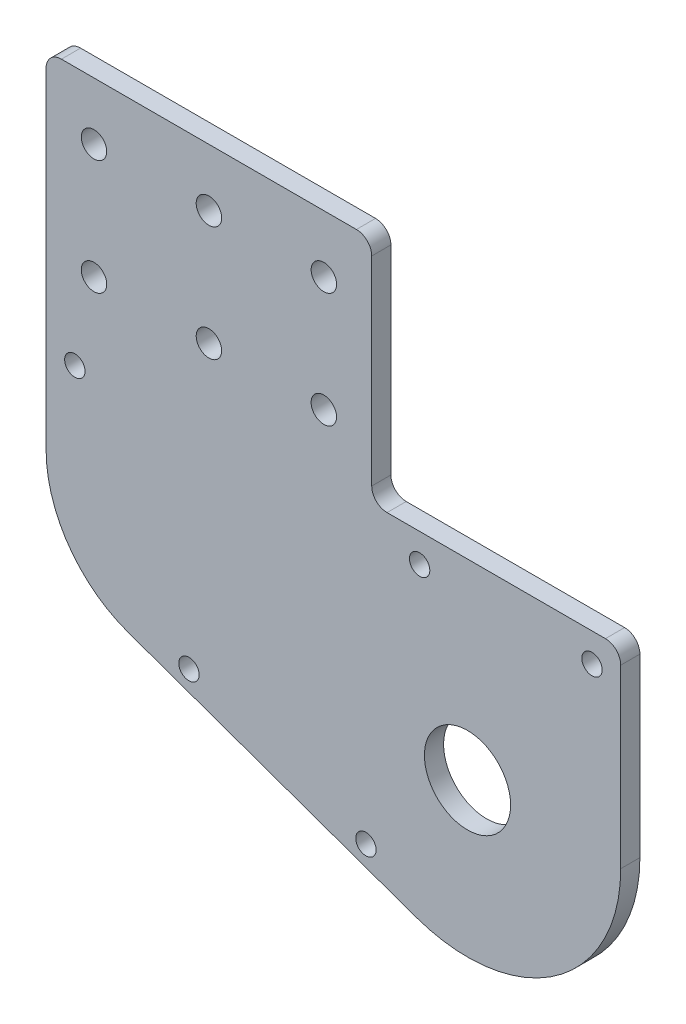
ISO-10303-21;
HEADER;
FILE_DESCRIPTION(('STEP AP214'),'2;1');
FILE_NAME('part.step','',(''),(''),'','','');
FILE_SCHEMA(('AUTOMOTIVE_DESIGN { 1 0 10303 214 1 1 1 1 }'));
ENDSEC;
DATA;
#1=APPLICATION_CONTEXT('core data for automotive mechanical design processes');
#2=APPLICATION_PROTOCOL_DEFINITION('international standard','automotive_design',2000,#1);
#3=PRODUCT_CONTEXT('',#1,'mechanical');
#4=PRODUCT('Part','Part','',(#3));
#5=PRODUCT_RELATED_PRODUCT_CATEGORY('part','',(#4));
#6=PRODUCT_DEFINITION_FORMATION('','',#4);
#7=PRODUCT_DEFINITION_CONTEXT('part definition',#1,'design');
#8=PRODUCT_DEFINITION('design','',#6,#7);
#9=PRODUCT_DEFINITION_SHAPE('','',#8);
#10=(LENGTH_UNIT() NAMED_UNIT(*) SI_UNIT(.MILLI.,.METRE.));
#11=(NAMED_UNIT(*) PLANE_ANGLE_UNIT() SI_UNIT($,.RADIAN.));
#12=(NAMED_UNIT(*) SI_UNIT($,.STERADIAN.) SOLID_ANGLE_UNIT());
#13=UNCERTAINTY_MEASURE_WITH_UNIT(LENGTH_MEASURE(1.E-05),#10,'distance_accuracy_value','');
#14=(GEOMETRIC_REPRESENTATION_CONTEXT(3) GLOBAL_UNCERTAINTY_ASSIGNED_CONTEXT((#13)) GLOBAL_UNIT_ASSIGNED_CONTEXT((#10,
#11,#12)) REPRESENTATION_CONTEXT('',''));
#15=CARTESIAN_POINT('',(0.,0.,0.));
#16=DIRECTION('',(0.,0.,1.));
#17=DIRECTION('',(1.,0.,0.));
#18=AXIS2_PLACEMENT_3D('',#15,#16,#17);
#19=CARTESIAN_POINT('',(0.,0.,0.));
#20=DIRECTION('',(0.,0.,-1.));
#21=DIRECTION('',(-1.,0.,0.));
#22=AXIS2_PLACEMENT_3D('',#19,#20,#21);
#23=PLANE('',#22);
#24=CARTESIAN_POINT('',(-47.625,82.55,0.));
#25=DIRECTION('',(0.,0.,1.));
#26=DIRECTION('',(1.,0.,0.));
#27=AXIS2_PLACEMENT_3D('',#24,#25,#26);
#28=CIRCLE('',#27,4.21640000000001);
#29=CARTESIAN_POINT('',(-43.4086,82.55,0.));
#30=VERTEX_POINT('',#29);
#31=EDGE_CURVE('E300',#30,#30,#28,.T.);
#32=ORIENTED_EDGE('',*,*,#31,.F.);
#33=EDGE_LOOP('',(#32));
#34=FACE_BOUND('',#33,.T.);
#35=CARTESIAN_POINT('',(-85.725,82.55,0.));
#36=DIRECTION('',(0.,0.,1.));
#37=DIRECTION('',(1.,0.,0.));
#38=AXIS2_PLACEMENT_3D('',#35,#36,#37);
#39=CIRCLE('',#38,4.21639999999999);
#40=CARTESIAN_POINT('',(-81.5086,82.55,0.));
#41=VERTEX_POINT('',#40);
#42=EDGE_CURVE('E299',#41,#41,#39,.T.);
#43=ORIENTED_EDGE('',*,*,#42,.F.);
#44=EDGE_LOOP('',(#43));
#45=FACE_BOUND('',#44,.T.);
#46=CARTESIAN_POINT('',(-85.725,120.65,0.));
#47=DIRECTION('',(0.,0.,1.));
#48=DIRECTION('',(1.,0.,0.));
#49=AXIS2_PLACEMENT_3D('',#46,#47,#48);
#50=CIRCLE('',#49,4.21639999999999);
#51=CARTESIAN_POINT('',(-81.5086,120.65,0.));
#52=VERTEX_POINT('',#51);
#53=EDGE_CURVE('E288',#52,#52,#50,.T.);
#54=ORIENTED_EDGE('',*,*,#53,.F.);
#55=EDGE_LOOP('',(#54));
#56=FACE_BOUND('',#55,.T.);
#57=CARTESIAN_POINT('',(-123.825,82.55,0.));
#58=DIRECTION('',(0.,0.,1.));
#59=DIRECTION('',(1.,0.,0.));
#60=AXIS2_PLACEMENT_3D('',#57,#58,#59);
#61=CIRCLE('',#60,4.21639999999999);
#62=CARTESIAN_POINT('',(-119.6086,82.55,0.));
#63=VERTEX_POINT('',#62);
#64=EDGE_CURVE('E287',#63,#63,#61,.T.);
#65=ORIENTED_EDGE('',*,*,#64,.F.);
#66=EDGE_LOOP('',(#65));
#67=FACE_BOUND('',#66,.T.);
#68=CARTESIAN_POINT('',(-47.625,120.65,0.));
#69=DIRECTION('',(0.,0.,1.));
#70=DIRECTION('',(1.,0.,0.));
#71=AXIS2_PLACEMENT_3D('',#68,#69,#70);
#72=CIRCLE('',#71,4.21640000000001);
#73=CARTESIAN_POINT('',(-43.4086,120.65,0.));
#74=VERTEX_POINT('',#73);
#75=EDGE_CURVE('E310',#74,#74,#72,.T.);
#76=ORIENTED_EDGE('',*,*,#75,.F.);
#77=EDGE_LOOP('',(#76));
#78=FACE_BOUND('',#77,.T.);
#79=CARTESIAN_POINT('',(-123.825,120.65,0.));
#80=DIRECTION('',(0.,0.,1.));
#81=DIRECTION('',(1.,0.,0.));
#82=AXIS2_PLACEMENT_3D('',#79,#80,#81);
#83=CIRCLE('',#82,4.21639999999999);
#84=CARTESIAN_POINT('',(-119.6086,120.65,0.));
#85=VERTEX_POINT('',#84);
#86=EDGE_CURVE('E280',#85,#85,#83,.T.);
#87=ORIENTED_EDGE('',*,*,#86,.F.);
#88=EDGE_LOOP('',(#87));
#89=FACE_BOUND('',#88,.T.);
#90=CARTESIAN_POINT('',(-33.6719922708708,-35.1835837319561,0.));
#91=DIRECTION('',(0.,0.,1.));
#92=DIRECTION('',(1.,0.,0.));
#93=AXIS2_PLACEMENT_3D('',#90,#91,#92);
#94=CIRCLE('',#93,3.3782);
#95=CARTESIAN_POINT('',(-30.2937922708708,-35.1835837319561,0.));
#96=VERTEX_POINT('',#95);
#97=EDGE_CURVE('E274',#96,#96,#94,.T.);
#98=ORIENTED_EDGE('',*,*,#97,.F.);
#99=EDGE_LOOP('',(#98));
#100=FACE_BOUND('',#99,.T.);
#101=CARTESIAN_POINT('',(-92.3449564519243,-14.2587955339083,0.));
#102=DIRECTION('',(0.,0.,1.));
#103=DIRECTION('',(1.,0.,0.));
#104=AXIS2_PLACEMENT_3D('',#101,#102,#103);
#105=CIRCLE('',#104,3.3782);
#106=CARTESIAN_POINT('',(-88.9667564519244,-14.2587955339083,0.));
#107=VERTEX_POINT('',#106);
#108=EDGE_CURVE('E268',#107,#107,#105,.T.);
#109=ORIENTED_EDGE('',*,*,#108,.F.);
#110=EDGE_LOOP('',(#109));
#111=FACE_BOUND('',#110,.T.);
#112=CARTESIAN_POINT('',(-130.175,53.975,0.));
#113=DIRECTION('',(0.,0.,1.));
#114=DIRECTION('',(1.,0.,0.));
#115=AXIS2_PLACEMENT_3D('',#112,#113,#114);
#116=CIRCLE('',#115,3.3782);
#117=CARTESIAN_POINT('',(-126.7968,53.975,0.));
#118=VERTEX_POINT('',#117);
#119=EDGE_CURVE('E262',#118,#118,#116,.T.);
#120=ORIENTED_EDGE('',*,*,#119,.F.);
#121=EDGE_LOOP('',(#120));
#122=FACE_BOUND('',#121,.T.);
#123=CARTESIAN_POINT('',(-15.875,53.975,0.));
#124=DIRECTION('',(0.,0.,1.));
#125=DIRECTION('',(1.,0.,0.));
#126=AXIS2_PLACEMENT_3D('',#123,#124,#125);
#127=CIRCLE('',#126,3.3782);
#128=CARTESIAN_POINT('',(-12.4968,53.975,0.));
#129=VERTEX_POINT('',#128);
#130=EDGE_CURVE('E256',#129,#129,#127,.T.);
#131=ORIENTED_EDGE('',*,*,#130,.F.);
#132=EDGE_LOOP('',(#131));
#133=FACE_BOUND('',#132,.T.);
#134=CARTESIAN_POINT('',(0.,0.,0.));
#135=DIRECTION('',(0.,0.,1.));
#136=DIRECTION('',(1.,0.,0.));
#137=AXIS2_PLACEMENT_3D('',#134,#135,#136);
#138=CIRCLE('',#137,14.2875);
#139=CARTESIAN_POINT('',(14.2875,0.,0.));
#140=VERTEX_POINT('',#139);
#141=EDGE_CURVE('E224',#140,#140,#138,.T.);
#142=ORIENTED_EDGE('',*,*,#141,.F.);
#143=EDGE_LOOP('',(#142));
#144=FACE_BOUND('',#143,.T.);
#145=DIRECTION('',(0.,1.,0.));
#146=VECTOR('',#145,1.);
#147=CARTESIAN_POINT('',(50.8,63.5,0.));
#148=LINE('',#147,#146);
#149=CARTESIAN_POINT('',(50.8,0.,0.));
#150=VERTEX_POINT('',#149);
#151=CARTESIAN_POINT('',(50.8,58.42,0.));
#152=VERTEX_POINT('',#151);
#153=EDGE_CURVE('E164',#150,#152,#148,.T.);
#154=ORIENTED_EDGE('',*,*,#153,.T.);
#155=CARTESIAN_POINT('',(45.72,58.42,0.));
#156=DIRECTION('',(0.,0.,-1.));
#157=DIRECTION('',(-1.,0.,0.));
#158=AXIS2_PLACEMENT_3D('',#155,#156,#157);
#159=CIRCLE('',#158,5.08);
#160=CARTESIAN_POINT('',(45.72,63.5,0.));
#161=VERTEX_POINT('',#160);
#162=EDGE_CURVE('E193',#152,#161,#159,.F.);
#163=ORIENTED_EDGE('',*,*,#162,.T.);
#164=DIRECTION('',(-1.,0.,0.));
#165=VECTOR('',#164,1.);
#166=CARTESIAN_POINT('',(50.8,63.5,0.));
#167=LINE('',#166,#165);
#168=CARTESIAN_POINT('',(-26.67,63.5,0.));
#169=VERTEX_POINT('',#168);
#170=EDGE_CURVE('E167',#161,#169,#167,.T.);
#171=ORIENTED_EDGE('',*,*,#170,.T.);
#172=CARTESIAN_POINT('',(-26.67,68.58,0.));
#173=DIRECTION('',(0.,0.,-1.));
#174=DIRECTION('',(-1.,0.,0.));
#175=AXIS2_PLACEMENT_3D('',#172,#173,#174);
#176=CIRCLE('',#175,5.08);
#177=CARTESIAN_POINT('',(-31.75,68.58,0.));
#178=VERTEX_POINT('',#177);
#179=EDGE_CURVE('E49',#169,#178,#176,.T.);
#180=ORIENTED_EDGE('',*,*,#179,.T.);
#181=DIRECTION('',(0.,1.,0.));
#182=VECTOR('',#181,1.);
#183=CARTESIAN_POINT('',(-31.75,139.7,0.));
#184=LINE('',#183,#182);
#185=CARTESIAN_POINT('',(-31.75,134.62,0.));
#186=VERTEX_POINT('',#185);
#187=EDGE_CURVE('E217',#178,#186,#184,.T.);
#188=ORIENTED_EDGE('',*,*,#187,.T.);
#189=CARTESIAN_POINT('',(-36.83,134.62,0.));
#190=DIRECTION('',(0.,0.,-1.));
#191=DIRECTION('',(-1.,0.,0.));
#192=AXIS2_PLACEMENT_3D('',#189,#190,#191);
#193=CIRCLE('',#192,5.08);
#194=CARTESIAN_POINT('',(-36.83,139.7,0.));
#195=VERTEX_POINT('',#194);
#196=EDGE_CURVE('E191',#186,#195,#193,.F.);
#197=ORIENTED_EDGE('',*,*,#196,.T.);
#198=DIRECTION('',(-1.,0.,0.));
#199=VECTOR('',#198,1.);
#200=CARTESIAN_POINT('',(-139.7,139.7,0.));
#201=LINE('',#200,#199);
#202=CARTESIAN_POINT('',(-134.62,139.7,0.));
#203=VERTEX_POINT('',#202);
#204=EDGE_CURVE('E223',#195,#203,#201,.T.);
#205=ORIENTED_EDGE('',*,*,#204,.T.);
#206=CARTESIAN_POINT('',(-134.62,134.62,0.));
#207=DIRECTION('',(0.,0.,-1.));
#208=DIRECTION('',(-1.,0.,0.));
#209=AXIS2_PLACEMENT_3D('',#206,#207,#208);
#210=CIRCLE('',#209,5.08);
#211=CARTESIAN_POINT('',(-139.7,134.62,0.));
#212=VERTEX_POINT('',#211);
#213=EDGE_CURVE('E189',#203,#212,#210,.F.);
#214=ORIENTED_EDGE('',*,*,#213,.T.);
#215=DIRECTION('',(0.,-1.,0.));
#216=VECTOR('',#215,1.);
#217=CARTESIAN_POINT('',(-139.7,24.9428,0.));
#218=LINE('',#217,#216);
#219=CARTESIAN_POINT('',(-139.7,24.9428,0.));
#220=VERTEX_POINT('',#219);
#221=EDGE_CURVE('E171',#212,#220,#218,.T.);
#222=ORIENTED_EDGE('',*,*,#221,.T.);
#223=CARTESIAN_POINT('',(-98.4906936119347,24.9428,0.));
#224=DIRECTION('',(0.,0.,1.));
#225=DIRECTION('',(-1.,0.,0.));
#226=AXIS2_PLACEMENT_3D('',#223,#224,#225);
#227=CIRCLE('',#226,41.2093063880653);
#228=CARTESIAN_POINT('',(-112.333373337092,-13.8719800587888,0.));
#229=VERTEX_POINT('',#228);
#230=EDGE_CURVE('E148',#220,#229,#227,.T.);
#231=ORIENTED_EDGE('',*,*,#230,.T.);
#232=DIRECTION('',(0.941893554171299,-0.335911495204554,0.));
#233=VECTOR('',#232,1.);
#234=CARTESIAN_POINT('',(-17.0643039563913,-47.848192551902,0.));
#235=LINE('',#234,#233);
#236=CARTESIAN_POINT('',(-17.0643039563913,-47.848192551902,0.));
#237=VERTEX_POINT('',#236);
#238=EDGE_CURVE('E174',#229,#237,#235,.T.);
#239=ORIENTED_EDGE('',*,*,#238,.T.);
#240=CARTESIAN_POINT('',(0.,0.,0.));
#241=DIRECTION('',(0.,0.,1.));
#242=DIRECTION('',(-1.,0.,0.));
#243=AXIS2_PLACEMENT_3D('',#240,#241,#242);
#244=CIRCLE('',#243,50.8);
#245=EDGE_CURVE('E177',#237,#150,#244,.T.);
#246=ORIENTED_EDGE('',*,*,#245,.T.);
#247=EDGE_LOOP('',(#154,#163,#171,#180,#188,#197,#205,#214,#222,#231,#239,#246));
#248=FACE_BOUND('',#247,.T.);
#249=CARTESIAN_POINT('',(41.275,53.975,0.));
#250=DIRECTION('',(0.,0.,1.));
#251=DIRECTION('',(1.,0.,0.));
#252=AXIS2_PLACEMENT_3D('',#249,#250,#251);
#253=CIRCLE('',#252,3.3782);
#254=CARTESIAN_POINT('',(44.6532,53.975,0.));
#255=VERTEX_POINT('',#254);
#256=EDGE_CURVE('E250',#255,#255,#253,.T.);
#257=ORIENTED_EDGE('',*,*,#256,.F.);
#258=EDGE_LOOP('',(#257));
#259=FACE_BOUND('',#258,.T.);
#260=ADVANCED_FACE('F41',(#34,#45,#56,#67,#78,#89,#100,#111,#122,#133,#144,#248,#259),#23,.F.);
#261=CARTESIAN_POINT('',(50.8,63.5,-6.35));
#262=DIRECTION('',(0.,1.,0.));
#263=DIRECTION('',(-1.,0.,0.));
#264=AXIS2_PLACEMENT_3D('',#261,#262,#263);
#265=PLANE('',#264);
#266=ORIENTED_EDGE('',*,*,#170,.F.);
#267=DIRECTION('',(0.,0.,1.));
#268=VECTOR('',#267,1.);
#269=CARTESIAN_POINT('',(45.72,63.5,-6.35));
#270=LINE('',#269,#268);
#271=CARTESIAN_POINT('',(45.72,63.5,-6.35));
#272=VERTEX_POINT('',#271);
#273=EDGE_CURVE('E198',#161,#272,#270,.F.);
#274=ORIENTED_EDGE('',*,*,#273,.T.);
#275=DIRECTION('',(-1.,0.,0.));
#276=VECTOR('',#275,1.);
#277=CARTESIAN_POINT('',(50.8,63.5,-6.35));
#278=LINE('',#277,#276);
#279=CARTESIAN_POINT('',(-26.67,63.5,-6.35));
#280=VERTEX_POINT('',#279);
#281=EDGE_CURVE('E142',#272,#280,#278,.T.);
#282=ORIENTED_EDGE('',*,*,#281,.T.);
#283=DIRECTION('',(0.,0.,1.));
#284=VECTOR('',#283,1.);
#285=CARTESIAN_POINT('',(-26.67,63.5,0.));
#286=LINE('',#285,#284);
#287=EDGE_CURVE('E195',#280,#169,#286,.T.);
#288=ORIENTED_EDGE('',*,*,#287,.T.);
#289=EDGE_LOOP('',(#266,#274,#282,#288));
#290=FACE_BOUND('',#289,.T.);
#291=ADVANCED_FACE('F232',(#290),#265,.T.);
#292=CARTESIAN_POINT('',(50.8,63.5,-6.35));
#293=DIRECTION('',(1.,0.,0.));
#294=DIRECTION('',(0.,0.,-1.));
#295=AXIS2_PLACEMENT_3D('',#292,#293,#294);
#296=PLANE('',#295);
#297=DIRECTION('',(0.,1.,0.));
#298=VECTOR('',#297,1.);
#299=CARTESIAN_POINT('',(50.8,63.5,-6.35));
#300=LINE('',#299,#298);
#301=CARTESIAN_POINT('',(50.8,0.,-6.35));
#302=VERTEX_POINT('',#301);
#303=CARTESIAN_POINT('',(50.8,58.42,-6.35));
#304=VERTEX_POINT('',#303);
#305=EDGE_CURVE('E180',#302,#304,#300,.T.);
#306=ORIENTED_EDGE('',*,*,#305,.T.);
#307=DIRECTION('',(0.,0.,1.));
#308=VECTOR('',#307,1.);
#309=CARTESIAN_POINT('',(50.8,58.42,-6.35));
#310=LINE('',#309,#308);
#311=EDGE_CURVE('E183',#304,#152,#310,.T.);
#312=ORIENTED_EDGE('',*,*,#311,.T.);
#313=ORIENTED_EDGE('',*,*,#153,.F.);
#314=DIRECTION('',(0.,0.,1.));
#315=VECTOR('',#314,1.);
#316=CARTESIAN_POINT('',(50.8,0.,-6.35));
#317=LINE('',#316,#315);
#318=EDGE_CURVE('E181',#302,#150,#317,.T.);
#319=ORIENTED_EDGE('',*,*,#318,.F.);
#320=EDGE_LOOP('',(#306,#312,#313,#319));
#321=FACE_BOUND('',#320,.T.);
#322=ADVANCED_FACE('F364',(#321),#296,.T.);
#323=CARTESIAN_POINT('',(0.,0.,-6.35));
#324=DIRECTION('',(0.,0.,1.));
#325=DIRECTION('',(1.,0.,0.));
#326=AXIS2_PLACEMENT_3D('',#323,#324,#325);
#327=CYLINDRICAL_SURFACE('',#326,50.8);
#328=ORIENTED_EDGE('',*,*,#245,.F.);
#329=DIRECTION('',(0.,0.,1.));
#330=VECTOR('',#329,1.);
#331=CARTESIAN_POINT('',(-17.0643039563913,-47.848192551902,-6.35));
#332=LINE('',#331,#330);
#333=CARTESIAN_POINT('',(-17.0643039563913,-47.848192551902,-6.35));
#334=VERTEX_POINT('',#333);
#335=EDGE_CURVE('E184',#334,#237,#332,.T.);
#336=ORIENTED_EDGE('',*,*,#335,.F.);
#337=CARTESIAN_POINT('',(0.,0.,-6.35));
#338=DIRECTION('',(0.,0.,1.));
#339=DIRECTION('',(-1.,0.,0.));
#340=AXIS2_PLACEMENT_3D('',#337,#338,#339);
#341=CIRCLE('',#340,50.8);
#342=EDGE_CURVE('E150',#334,#302,#341,.T.);
#343=ORIENTED_EDGE('',*,*,#342,.T.);
#344=ORIENTED_EDGE('',*,*,#318,.T.);
#345=EDGE_LOOP('',(#328,#336,#343,#344));
#346=FACE_BOUND('',#345,.T.);
#347=ADVANCED_FACE('F360',(#346),#327,.T.);
#348=CARTESIAN_POINT('',(-17.0643039563913,-47.848192551902,-6.35));
#349=DIRECTION('',(-0.335911495204554,-0.941893554171299,0.));
#350=DIRECTION('',(0.941893554171299,-0.335911495204554,0.));
#351=AXIS2_PLACEMENT_3D('',#348,#349,#350);
#352=PLANE('',#351);
#353=ORIENTED_EDGE('',*,*,#238,.F.);
#354=DIRECTION('',(0.,0.,1.));
#355=VECTOR('',#354,1.);
#356=CARTESIAN_POINT('',(-112.333373337092,-13.8719800587888,-6.35));
#357=LINE('',#356,#355);
#358=CARTESIAN_POINT('',(-112.333373337092,-13.8719800587888,-6.35));
#359=VERTEX_POINT('',#358);
#360=EDGE_CURVE('E149',#359,#229,#357,.T.);
#361=ORIENTED_EDGE('',*,*,#360,.F.);
#362=DIRECTION('',(0.941893554171299,-0.335911495204554,0.));
#363=VECTOR('',#362,1.);
#364=CARTESIAN_POINT('',(-17.0643039563913,-47.848192551902,-6.35));
#365=LINE('',#364,#363);
#366=EDGE_CURVE('E157',#359,#334,#365,.T.);
#367=ORIENTED_EDGE('',*,*,#366,.T.);
#368=ORIENTED_EDGE('',*,*,#335,.T.);
#369=EDGE_LOOP('',(#353,#361,#367,#368));
#370=FACE_BOUND('',#369,.T.);
#371=ADVANCED_FACE('F363',(#370),#352,.T.);
#372=CARTESIAN_POINT('',(-98.4906936119347,24.9428,-6.35));
#373=DIRECTION('',(0.,0.,1.));
#374=DIRECTION('',(1.,0.,0.));
#375=AXIS2_PLACEMENT_3D('',#372,#373,#374);
#376=CYLINDRICAL_SURFACE('',#375,41.2093063880653);
#377=ORIENTED_EDGE('',*,*,#230,.F.);
#378=DIRECTION('',(0.,0.,1.));
#379=VECTOR('',#378,1.);
#380=CARTESIAN_POINT('',(-139.7,24.9428,-6.35));
#381=LINE('',#380,#379);
#382=CARTESIAN_POINT('',(-139.7,24.9428,-6.35));
#383=VERTEX_POINT('',#382);
#384=EDGE_CURVE('E135',#383,#220,#381,.T.);
#385=ORIENTED_EDGE('',*,*,#384,.F.);
#386=CARTESIAN_POINT('',(-98.4906936119347,24.9428,-6.35));
#387=DIRECTION('',(0.,0.,1.));
#388=DIRECTION('',(-1.,0.,0.));
#389=AXIS2_PLACEMENT_3D('',#386,#387,#388);
#390=CIRCLE('',#389,41.2093063880653);
#391=EDGE_CURVE('E141',#383,#359,#390,.T.);
#392=ORIENTED_EDGE('',*,*,#391,.T.);
#393=ORIENTED_EDGE('',*,*,#360,.T.);
#394=EDGE_LOOP('',(#377,#385,#392,#393));
#395=FACE_BOUND('',#394,.T.);
#396=ADVANCED_FACE('F146',(#395),#376,.T.);
#397=CARTESIAN_POINT('',(-139.7,24.9428,-6.35));
#398=DIRECTION('',(-1.,0.,0.));
#399=DIRECTION('',(0.,-1.,0.));
#400=AXIS2_PLACEMENT_3D('',#397,#398,#399);
#401=PLANE('',#400);
#402=ORIENTED_EDGE('',*,*,#221,.F.);
#403=DIRECTION('',(0.,0.,1.));
#404=VECTOR('',#403,1.);
#405=CARTESIAN_POINT('',(-139.7,134.62,-6.35));
#406=LINE('',#405,#404);
#407=CARTESIAN_POINT('',(-139.7,134.62,-6.35));
#408=VERTEX_POINT('',#407);
#409=EDGE_CURVE('E138',#212,#408,#406,.F.);
#410=ORIENTED_EDGE('',*,*,#409,.T.);
#411=DIRECTION('',(0.,-1.,0.));
#412=VECTOR('',#411,1.);
#413=CARTESIAN_POINT('',(-139.7,24.9428,-6.35));
#414=LINE('',#413,#412);
#415=EDGE_CURVE('E131',#408,#383,#414,.T.);
#416=ORIENTED_EDGE('',*,*,#415,.T.);
#417=ORIENTED_EDGE('',*,*,#384,.T.);
#418=EDGE_LOOP('',(#402,#410,#416,#417));
#419=FACE_BOUND('',#418,.T.);
#420=ADVANCED_FACE('F134',(#419),#401,.T.);
#421=CARTESIAN_POINT('',(0.,0.,-6.35));
#422=DIRECTION('',(0.,0.,-1.));
#423=DIRECTION('',(-1.,0.,0.));
#424=AXIS2_PLACEMENT_3D('',#421,#422,#423);
#425=PLANE('',#424);
#426=CARTESIAN_POINT('',(-47.625,82.55,-6.35));
#427=DIRECTION('',(0.,0.,-1.));
#428=DIRECTION('',(-1.,0.,0.));
#429=AXIS2_PLACEMENT_3D('',#426,#427,#428);
#430=CIRCLE('',#429,4.21640000000001);
#431=CARTESIAN_POINT('',(-51.8414,82.55,-6.35));
#432=VERTEX_POINT('',#431);
#433=EDGE_CURVE('E296',#432,#432,#430,.F.);
#434=ORIENTED_EDGE('',*,*,#433,.T.);
#435=EDGE_LOOP('',(#434));
#436=FACE_BOUND('',#435,.T.);
#437=CARTESIAN_POINT('',(-85.725,82.55,-6.35));
#438=DIRECTION('',(0.,0.,-1.));
#439=DIRECTION('',(-1.,0.,0.));
#440=AXIS2_PLACEMENT_3D('',#437,#438,#439);
#441=CIRCLE('',#440,4.21639999999999);
#442=CARTESIAN_POINT('',(-89.9414,82.55,-6.35));
#443=VERTEX_POINT('',#442);
#444=EDGE_CURVE('E291',#443,#443,#441,.F.);
#445=ORIENTED_EDGE('',*,*,#444,.T.);
#446=EDGE_LOOP('',(#445));
#447=FACE_BOUND('',#446,.T.);
#448=CARTESIAN_POINT('',(-85.725,120.65,-6.35));
#449=DIRECTION('',(0.,0.,-1.));
#450=DIRECTION('',(-1.,0.,0.));
#451=AXIS2_PLACEMENT_3D('',#448,#449,#450);
#452=CIRCLE('',#451,4.21639999999999);
#453=CARTESIAN_POINT('',(-89.9414,120.65,-6.35));
#454=VERTEX_POINT('',#453);
#455=EDGE_CURVE('E284',#454,#454,#452,.F.);
#456=ORIENTED_EDGE('',*,*,#455,.T.);
#457=EDGE_LOOP('',(#456));
#458=FACE_BOUND('',#457,.T.);
#459=CARTESIAN_POINT('',(-123.825,82.55,-6.35));
#460=DIRECTION('',(0.,0.,-1.));
#461=DIRECTION('',(-1.,0.,0.));
#462=AXIS2_PLACEMENT_3D('',#459,#460,#461);
#463=CIRCLE('',#462,4.21639999999999);
#464=CARTESIAN_POINT('',(-128.0414,82.55,-6.35));
#465=VERTEX_POINT('',#464);
#466=EDGE_CURVE('E283',#465,#465,#463,.F.);
#467=ORIENTED_EDGE('',*,*,#466,.T.);
#468=EDGE_LOOP('',(#467));
#469=FACE_BOUND('',#468,.T.);
#470=CARTESIAN_POINT('',(-47.625,120.65,-6.35));
#471=DIRECTION('',(0.,0.,-1.));
#472=DIRECTION('',(-1.,0.,0.));
#473=AXIS2_PLACEMENT_3D('',#470,#471,#472);
#474=CIRCLE('',#473,4.21640000000001);
#475=CARTESIAN_POINT('',(-51.8414,120.65,-6.35));
#476=VERTEX_POINT('',#475);
#477=EDGE_CURVE('E303',#476,#476,#474,.F.);
#478=ORIENTED_EDGE('',*,*,#477,.T.);
#479=EDGE_LOOP('',(#478));
#480=FACE_BOUND('',#479,.T.);
#481=CARTESIAN_POINT('',(-123.825,120.65,-6.35));
#482=DIRECTION('',(0.,0.,-1.));
#483=DIRECTION('',(-1.,0.,0.));
#484=AXIS2_PLACEMENT_3D('',#481,#482,#483);
#485=CIRCLE('',#484,4.21639999999999);
#486=CARTESIAN_POINT('',(-128.0414,120.65,-6.35));
#487=VERTEX_POINT('',#486);
#488=EDGE_CURVE('E277',#487,#487,#485,.F.);
#489=ORIENTED_EDGE('',*,*,#488,.T.);
#490=EDGE_LOOP('',(#489));
#491=FACE_BOUND('',#490,.T.);
#492=CARTESIAN_POINT('',(-33.6719922708708,-35.1835837319561,-6.35));
#493=DIRECTION('',(0.,0.,1.));
#494=DIRECTION('',(1.,0.,0.));
#495=AXIS2_PLACEMENT_3D('',#492,#493,#494);
#496=CIRCLE('',#495,3.3782);
#497=CARTESIAN_POINT('',(-30.2937922708708,-35.1835837319561,-6.35));
#498=VERTEX_POINT('',#497);
#499=EDGE_CURVE('E271',#498,#498,#496,.T.);
#500=ORIENTED_EDGE('',*,*,#499,.T.);
#501=EDGE_LOOP('',(#500));
#502=FACE_BOUND('',#501,.T.);
#503=CARTESIAN_POINT('',(-92.3449564519243,-14.2587955339083,-6.35));
#504=DIRECTION('',(0.,0.,1.));
#505=DIRECTION('',(1.,0.,0.));
#506=AXIS2_PLACEMENT_3D('',#503,#504,#505);
#507=CIRCLE('',#506,3.3782);
#508=CARTESIAN_POINT('',(-88.9667564519244,-14.2587955339083,-6.35));
#509=VERTEX_POINT('',#508);
#510=EDGE_CURVE('E265',#509,#509,#507,.T.);
#511=ORIENTED_EDGE('',*,*,#510,.T.);
#512=EDGE_LOOP('',(#511));
#513=FACE_BOUND('',#512,.T.);
#514=CARTESIAN_POINT('',(-130.175,53.975,-6.35));
#515=DIRECTION('',(0.,0.,1.));
#516=DIRECTION('',(1.,0.,0.));
#517=AXIS2_PLACEMENT_3D('',#514,#515,#516);
#518=CIRCLE('',#517,3.3782);
#519=CARTESIAN_POINT('',(-126.7968,53.975,-6.35));
#520=VERTEX_POINT('',#519);
#521=EDGE_CURVE('E259',#520,#520,#518,.T.);
#522=ORIENTED_EDGE('',*,*,#521,.T.);
#523=EDGE_LOOP('',(#522));
#524=FACE_BOUND('',#523,.T.);
#525=CARTESIAN_POINT('',(-15.875,53.975,-6.35));
#526=DIRECTION('',(0.,0.,1.));
#527=DIRECTION('',(1.,0.,0.));
#528=AXIS2_PLACEMENT_3D('',#525,#526,#527);
#529=CIRCLE('',#528,3.3782);
#530=CARTESIAN_POINT('',(-12.4968,53.975,-6.35));
#531=VERTEX_POINT('',#530);
#532=EDGE_CURVE('E253',#531,#531,#529,.T.);
#533=ORIENTED_EDGE('',*,*,#532,.T.);
#534=EDGE_LOOP('',(#533));
#535=FACE_BOUND('',#534,.T.);
#536=CARTESIAN_POINT('',(41.275,53.975,-6.35));
#537=DIRECTION('',(0.,0.,1.));
#538=DIRECTION('',(1.,0.,0.));
#539=AXIS2_PLACEMENT_3D('',#536,#537,#538);
#540=CIRCLE('',#539,3.3782);
#541=CARTESIAN_POINT('',(44.6532,53.975,-6.35));
#542=VERTEX_POINT('',#541);
#543=EDGE_CURVE('E245',#542,#542,#540,.T.);
#544=ORIENTED_EDGE('',*,*,#543,.T.);
#545=EDGE_LOOP('',(#544));
#546=FACE_BOUND('',#545,.T.);
#547=CARTESIAN_POINT('',(0.,0.,-6.35));
#548=DIRECTION('',(0.,0.,-1.));
#549=DIRECTION('',(-1.,0.,0.));
#550=AXIS2_PLACEMENT_3D('',#547,#548,#549);
#551=CIRCLE('',#550,14.2875);
#552=CARTESIAN_POINT('',(-14.2875,0.,-6.35));
#553=VERTEX_POINT('',#552);
#554=EDGE_CURVE('E242',#553,#553,#551,.F.);
#555=ORIENTED_EDGE('',*,*,#554,.T.);
#556=EDGE_LOOP('',(#555));
#557=FACE_BOUND('',#556,.T.);
#558=ORIENTED_EDGE('',*,*,#281,.F.);
#559=CARTESIAN_POINT('',(45.72,58.42,-6.35));
#560=DIRECTION('',(0.,0.,-1.));
#561=DIRECTION('',(-1.,0.,0.));
#562=AXIS2_PLACEMENT_3D('',#559,#560,#561);
#563=CIRCLE('',#562,5.08);
#564=EDGE_CURVE('E203',#272,#304,#563,.T.);
#565=ORIENTED_EDGE('',*,*,#564,.T.);
#566=ORIENTED_EDGE('',*,*,#305,.F.);
#567=ORIENTED_EDGE('',*,*,#342,.F.);
#568=ORIENTED_EDGE('',*,*,#366,.F.);
#569=ORIENTED_EDGE('',*,*,#391,.F.);
#570=ORIENTED_EDGE('',*,*,#415,.F.);
#571=CARTESIAN_POINT('',(-134.62,134.62,-6.34999999999999));
#572=DIRECTION('',(0.,0.,-1.));
#573=DIRECTION('',(-1.,0.,0.));
#574=AXIS2_PLACEMENT_3D('',#571,#572,#573);
#575=CIRCLE('',#574,5.08);
#576=CARTESIAN_POINT('',(-134.62,139.7,-6.34999999999999));
#577=VERTEX_POINT('',#576);
#578=EDGE_CURVE('E200',#408,#577,#575,.T.);
#579=ORIENTED_EDGE('',*,*,#578,.T.);
#580=DIRECTION('',(-1.,0.,0.));
#581=VECTOR('',#580,1.);
#582=CARTESIAN_POINT('',(-139.7,139.7,-6.34999999999999));
#583=LINE('',#582,#581);
#584=CARTESIAN_POINT('',(-36.83,139.7,-6.34999999999999));
#585=VERTEX_POINT('',#584);
#586=EDGE_CURVE('E168',#585,#577,#583,.T.);
#587=ORIENTED_EDGE('',*,*,#586,.F.);
#588=CARTESIAN_POINT('',(-36.83,134.62,-6.34999999999999));
#589=DIRECTION('',(0.,0.,-1.));
#590=DIRECTION('',(-1.,0.,0.));
#591=AXIS2_PLACEMENT_3D('',#588,#589,#590);
#592=CIRCLE('',#591,5.08);
#593=CARTESIAN_POINT('',(-31.75,134.62,-6.34999999999999));
#594=VERTEX_POINT('',#593);
#595=EDGE_CURVE('E56',#585,#594,#592,.T.);
#596=ORIENTED_EDGE('',*,*,#595,.T.);
#597=DIRECTION('',(0.,1.,0.));
#598=VECTOR('',#597,1.);
#599=CARTESIAN_POINT('',(-31.75,139.7,-6.34999999999999));
#600=LINE('',#599,#598);
#601=CARTESIAN_POINT('',(-31.75,68.58,-6.34999999999999));
#602=VERTEX_POINT('',#601);
#603=EDGE_CURVE('E230',#602,#594,#600,.T.);
#604=ORIENTED_EDGE('',*,*,#603,.F.);
#605=CARTESIAN_POINT('',(-26.67,68.58,-6.35));
#606=DIRECTION('',(0.,0.,-1.));
#607=DIRECTION('',(-1.,0.,0.));
#608=AXIS2_PLACEMENT_3D('',#605,#606,#607);
#609=CIRCLE('',#608,5.08);
#610=EDGE_CURVE('E11',#602,#280,#609,.F.);
#611=ORIENTED_EDGE('',*,*,#610,.T.);
#612=EDGE_LOOP('',(#558,#565,#566,#567,#568,#569,#570,#579,#587,#596,#604,#611));
#613=FACE_BOUND('',#612,.T.);
#614=ADVANCED_FACE('F154',(#436,#447,#458,#469,#480,#491,#502,#513,#524,#535,#546,#557,#613),
#425,.T.);
#615=CARTESIAN_POINT('',(-31.75,139.7,-138.484940496449));
#616=DIRECTION('',(1.,0.,0.));
#617=DIRECTION('',(0.,1.,0.));
#618=AXIS2_PLACEMENT_3D('',#615,#616,#617);
#619=PLANE('',#618);
#620=ORIENTED_EDGE('',*,*,#187,.F.);
#621=DIRECTION('',(0.,0.,1.));
#622=VECTOR('',#621,1.);
#623=CARTESIAN_POINT('',(-31.75,68.58,-6.34999999999999));
#624=LINE('',#623,#622);
#625=EDGE_CURVE('E63',#178,#602,#624,.F.);
#626=ORIENTED_EDGE('',*,*,#625,.T.);
#627=ORIENTED_EDGE('',*,*,#603,.T.);
#628=DIRECTION('',(0.,0.,1.));
#629=VECTOR('',#628,1.);
#630=CARTESIAN_POINT('',(-31.75,134.62,-138.484940496449));
#631=LINE('',#630,#629);
#632=EDGE_CURVE('E205',#594,#186,#631,.T.);
#633=ORIENTED_EDGE('',*,*,#632,.T.);
#634=EDGE_LOOP('',(#620,#626,#627,#633));
#635=FACE_BOUND('',#634,.T.);
#636=ADVANCED_FACE('F221',(#635),#619,.T.);
#637=CARTESIAN_POINT('',(-139.7,139.7,-138.484940496449));
#638=DIRECTION('',(0.,1.,0.));
#639=DIRECTION('',(0.,0.,1.));
#640=AXIS2_PLACEMENT_3D('',#637,#638,#639);
#641=PLANE('',#640);
#642=ORIENTED_EDGE('',*,*,#204,.F.);
#643=DIRECTION('',(0.,0.,1.));
#644=VECTOR('',#643,1.);
#645=CARTESIAN_POINT('',(-36.83,139.7,-138.484940496449));
#646=LINE('',#645,#644);
#647=EDGE_CURVE('E212',#195,#585,#646,.F.);
#648=ORIENTED_EDGE('',*,*,#647,.T.);
#649=ORIENTED_EDGE('',*,*,#586,.T.);
#650=DIRECTION('',(0.,0.,1.));
#651=VECTOR('',#650,1.);
#652=CARTESIAN_POINT('',(-134.62,139.7,-138.484940496449));
#653=LINE('',#652,#651);
#654=EDGE_CURVE('E209',#577,#203,#653,.T.);
#655=ORIENTED_EDGE('',*,*,#654,.T.);
#656=EDGE_LOOP('',(#642,#648,#649,#655));
#657=FACE_BOUND('',#656,.T.);
#658=ADVANCED_FACE('F350',(#657),#641,.T.);
#659=CARTESIAN_POINT('',(45.72,58.42,-6.35));
#660=DIRECTION('',(0.,0.,1.));
#661=DIRECTION('',(1.,0.,0.));
#662=AXIS2_PLACEMENT_3D('',#659,#660,#661);
#663=CYLINDRICAL_SURFACE('',#662,5.08);
#664=ORIENTED_EDGE('',*,*,#564,.F.);
#665=ORIENTED_EDGE('',*,*,#273,.F.);
#666=ORIENTED_EDGE('',*,*,#162,.F.);
#667=ORIENTED_EDGE('',*,*,#311,.F.);
#668=EDGE_LOOP('',(#664,#665,#666,#667));
#669=FACE_BOUND('',#668,.T.);
#670=ADVANCED_FACE('F353',(#669),#663,.T.);
#671=CARTESIAN_POINT('',(-26.67,68.58,-6.35));
#672=DIRECTION('',(0.,0.,-1.));
#673=DIRECTION('',(-1.,0.,0.));
#674=AXIS2_PLACEMENT_3D('',#671,#672,#673);
#675=CYLINDRICAL_SURFACE('',#674,5.08);
#676=ORIENTED_EDGE('',*,*,#610,.F.);
#677=ORIENTED_EDGE('',*,*,#625,.F.);
#678=ORIENTED_EDGE('',*,*,#179,.F.);
#679=ORIENTED_EDGE('',*,*,#287,.F.);
#680=EDGE_LOOP('',(#676,#677,#678,#679));
#681=FACE_BOUND('',#680,.T.);
#682=ADVANCED_FACE('F227',(#681),#675,.F.);
#683=CARTESIAN_POINT('',(-36.83,134.62,-138.484940496449));
#684=DIRECTION('',(0.,0.,1.));
#685=DIRECTION('',(1.,0.,0.));
#686=AXIS2_PLACEMENT_3D('',#683,#684,#685);
#687=CYLINDRICAL_SURFACE('',#686,5.08);
#688=ORIENTED_EDGE('',*,*,#595,.F.);
#689=ORIENTED_EDGE('',*,*,#647,.F.);
#690=ORIENTED_EDGE('',*,*,#196,.F.);
#691=ORIENTED_EDGE('',*,*,#632,.F.);
#692=EDGE_LOOP('',(#688,#689,#690,#691));
#693=FACE_BOUND('',#692,.T.);
#694=ADVANCED_FACE('F345',(#693),#687,.T.);
#695=CARTESIAN_POINT('',(-134.62,134.62,-138.484940496449));
#696=DIRECTION('',(0.,0.,1.));
#697=DIRECTION('',(1.,0.,0.));
#698=AXIS2_PLACEMENT_3D('',#695,#696,#697);
#699=CYLINDRICAL_SURFACE('',#698,5.08);
#700=ORIENTED_EDGE('',*,*,#578,.F.);
#701=ORIENTED_EDGE('',*,*,#409,.F.);
#702=ORIENTED_EDGE('',*,*,#213,.F.);
#703=ORIENTED_EDGE('',*,*,#654,.F.);
#704=EDGE_LOOP('',(#700,#701,#702,#703));
#705=FACE_BOUND('',#704,.T.);
#706=ADVANCED_FACE('F43',(#705),#699,.T.);
#707=CARTESIAN_POINT('',(0.,0.,-6.351));
#708=DIRECTION('',(0.,0.,1.));
#709=DIRECTION('',(1.,0.,0.));
#710=AXIS2_PLACEMENT_3D('',#707,#708,#709);
#711=CYLINDRICAL_SURFACE('',#710,14.2875);
#712=ORIENTED_EDGE('',*,*,#554,.F.);
#713=EDGE_LOOP('',(#712));
#714=FACE_BOUND('',#713,.T.);
#715=ORIENTED_EDGE('',*,*,#141,.T.);
#716=EDGE_LOOP('',(#715));
#717=FACE_BOUND('',#716,.T.);
#718=ADVANCED_FACE('F333',(#714,#717),#711,.F.);
#719=CARTESIAN_POINT('',(41.275,53.975,0.));
#720=DIRECTION('',(0.,0.,1.));
#721=DIRECTION('',(1.,0.,0.));
#722=AXIS2_PLACEMENT_3D('',#719,#720,#721);
#723=CYLINDRICAL_SURFACE('',#722,3.3782);
#724=ORIENTED_EDGE('',*,*,#543,.F.);
#725=EDGE_LOOP('',(#724));
#726=FACE_BOUND('',#725,.T.);
#727=ORIENTED_EDGE('',*,*,#256,.T.);
#728=EDGE_LOOP('',(#727));
#729=FACE_BOUND('',#728,.T.);
#730=ADVANCED_FACE('F335',(#726,#729),#723,.F.);
#731=CARTESIAN_POINT('',(-15.875,53.975,0.));
#732=DIRECTION('',(0.,0.,1.));
#733=DIRECTION('',(1.,0.,0.));
#734=AXIS2_PLACEMENT_3D('',#731,#732,#733);
#735=CYLINDRICAL_SURFACE('',#734,3.3782);
#736=ORIENTED_EDGE('',*,*,#532,.F.);
#737=EDGE_LOOP('',(#736));
#738=FACE_BOUND('',#737,.T.);
#739=ORIENTED_EDGE('',*,*,#130,.T.);
#740=EDGE_LOOP('',(#739));
#741=FACE_BOUND('',#740,.T.);
#742=ADVANCED_FACE('F342',(#738,#741),#735,.F.);
#743=CARTESIAN_POINT('',(-130.175,53.975,0.));
#744=DIRECTION('',(0.,0.,1.));
#745=DIRECTION('',(1.,0.,0.));
#746=AXIS2_PLACEMENT_3D('',#743,#744,#745);
#747=CYLINDRICAL_SURFACE('',#746,3.3782);
#748=ORIENTED_EDGE('',*,*,#521,.F.);
#749=EDGE_LOOP('',(#748));
#750=FACE_BOUND('',#749,.T.);
#751=ORIENTED_EDGE('',*,*,#119,.T.);
#752=EDGE_LOOP('',(#751));
#753=FACE_BOUND('',#752,.T.);
#754=ADVANCED_FACE('F429',(#750,#753),#747,.F.);
#755=CARTESIAN_POINT('',(-92.3449564519243,-14.2587955339083,0.));
#756=DIRECTION('',(0.,0.,1.));
#757=DIRECTION('',(1.,0.,0.));
#758=AXIS2_PLACEMENT_3D('',#755,#756,#757);
#759=CYLINDRICAL_SURFACE('',#758,3.3782);
#760=ORIENTED_EDGE('',*,*,#510,.F.);
#761=EDGE_LOOP('',(#760));
#762=FACE_BOUND('',#761,.T.);
#763=ORIENTED_EDGE('',*,*,#108,.T.);
#764=EDGE_LOOP('',(#763));
#765=FACE_BOUND('',#764,.T.);
#766=ADVANCED_FACE('F438',(#762,#765),#759,.F.);
#767=CARTESIAN_POINT('',(-33.6719922708708,-35.1835837319561,0.));
#768=DIRECTION('',(0.,0.,1.));
#769=DIRECTION('',(1.,0.,0.));
#770=AXIS2_PLACEMENT_3D('',#767,#768,#769);
#771=CYLINDRICAL_SURFACE('',#770,3.3782);
#772=ORIENTED_EDGE('',*,*,#499,.F.);
#773=EDGE_LOOP('',(#772));
#774=FACE_BOUND('',#773,.T.);
#775=ORIENTED_EDGE('',*,*,#97,.T.);
#776=EDGE_LOOP('',(#775));
#777=FACE_BOUND('',#776,.T.);
#778=ADVANCED_FACE('F448',(#774,#777),#771,.F.);
#779=CARTESIAN_POINT('',(-123.825,120.65,-18.2757801287799));
#780=DIRECTION('',(0.,0.,1.));
#781=DIRECTION('',(1.,0.,0.));
#782=AXIS2_PLACEMENT_3D('',#779,#780,#781);
#783=CYLINDRICAL_SURFACE('',#782,4.21639999999999);
#784=ORIENTED_EDGE('',*,*,#86,.T.);
#785=EDGE_LOOP('',(#784));
#786=FACE_BOUND('',#785,.T.);
#787=ORIENTED_EDGE('',*,*,#488,.F.);
#788=EDGE_LOOP('',(#787));
#789=FACE_BOUND('',#788,.T.);
#790=ADVANCED_FACE('F458',(#786,#789),#783,.F.);
#791=CARTESIAN_POINT('',(-47.625,120.65,-18.2757801287799));
#792=DIRECTION('',(0.,0.,1.));
#793=DIRECTION('',(1.,0.,0.));
#794=AXIS2_PLACEMENT_3D('',#791,#792,#793);
#795=CYLINDRICAL_SURFACE('',#794,4.21640000000001);
#796=ORIENTED_EDGE('',*,*,#75,.T.);
#797=EDGE_LOOP('',(#796));
#798=FACE_BOUND('',#797,.T.);
#799=ORIENTED_EDGE('',*,*,#477,.F.);
#800=EDGE_LOOP('',(#799));
#801=FACE_BOUND('',#800,.T.);
#802=ADVANCED_FACE('F314',(#798,#801),#795,.F.);
#803=CARTESIAN_POINT('',(-123.825,82.55,-18.2757801287799));
#804=DIRECTION('',(0.,0.,1.));
#805=DIRECTION('',(1.,0.,0.));
#806=AXIS2_PLACEMENT_3D('',#803,#804,#805);
#807=CYLINDRICAL_SURFACE('',#806,4.21639999999999);
#808=ORIENTED_EDGE('',*,*,#64,.T.);
#809=EDGE_LOOP('',(#808));
#810=FACE_BOUND('',#809,.T.);
#811=ORIENTED_EDGE('',*,*,#466,.F.);
#812=EDGE_LOOP('',(#811));
#813=FACE_BOUND('',#812,.T.);
#814=ADVANCED_FACE('F477',(#810,#813),#807,.F.);
#815=CARTESIAN_POINT('',(-85.725,120.65,-18.2757801287799));
#816=DIRECTION('',(0.,0.,1.));
#817=DIRECTION('',(1.,0.,0.));
#818=AXIS2_PLACEMENT_3D('',#815,#816,#817);
#819=CYLINDRICAL_SURFACE('',#818,4.21639999999999);
#820=ORIENTED_EDGE('',*,*,#53,.T.);
#821=EDGE_LOOP('',(#820));
#822=FACE_BOUND('',#821,.T.);
#823=ORIENTED_EDGE('',*,*,#455,.F.);
#824=EDGE_LOOP('',(#823));
#825=FACE_BOUND('',#824,.T.);
#826=ADVANCED_FACE('F489',(#822,#825),#819,.F.);
#827=CARTESIAN_POINT('',(-85.725,82.55,-18.2757801287799));
#828=DIRECTION('',(0.,0.,1.));
#829=DIRECTION('',(1.,0.,0.));
#830=AXIS2_PLACEMENT_3D('',#827,#828,#829);
#831=CYLINDRICAL_SURFACE('',#830,4.21639999999999);
#832=ORIENTED_EDGE('',*,*,#42,.T.);
#833=EDGE_LOOP('',(#832));
#834=FACE_BOUND('',#833,.T.);
#835=ORIENTED_EDGE('',*,*,#444,.F.);
#836=EDGE_LOOP('',(#835));
#837=FACE_BOUND('',#836,.T.);
#838=ADVANCED_FACE('F499',(#834,#837),#831,.F.);
#839=CARTESIAN_POINT('',(-47.625,82.55,-18.2757801287799));
#840=DIRECTION('',(0.,0.,1.));
#841=DIRECTION('',(1.,0.,0.));
#842=AXIS2_PLACEMENT_3D('',#839,#840,#841);
#843=CYLINDRICAL_SURFACE('',#842,4.21640000000001);
#844=ORIENTED_EDGE('',*,*,#31,.T.);
#845=EDGE_LOOP('',(#844));
#846=FACE_BOUND('',#845,.T.);
#847=ORIENTED_EDGE('',*,*,#433,.F.);
#848=EDGE_LOOP('',(#847));
#849=FACE_BOUND('',#848,.T.);
#850=ADVANCED_FACE('F509',(#846,#849),#843,.F.);
#851=CLOSED_SHELL('',(#260,#291,#322,#347,#371,#396,#420,#614,#636,#658,#670,#682,#694,#706,
#718,#730,#742,#754,#766,#778,#790,#802,#814,#826,#838,#850));
#852=MANIFOLD_SOLID_BREP('B2',#851);
#853=ADVANCED_BREP_SHAPE_REPRESENTATION('',(#18,#852),#14);
#854=SHAPE_DEFINITION_REPRESENTATION(#9,#853);
ENDSEC;
END-ISO-10303-21;
